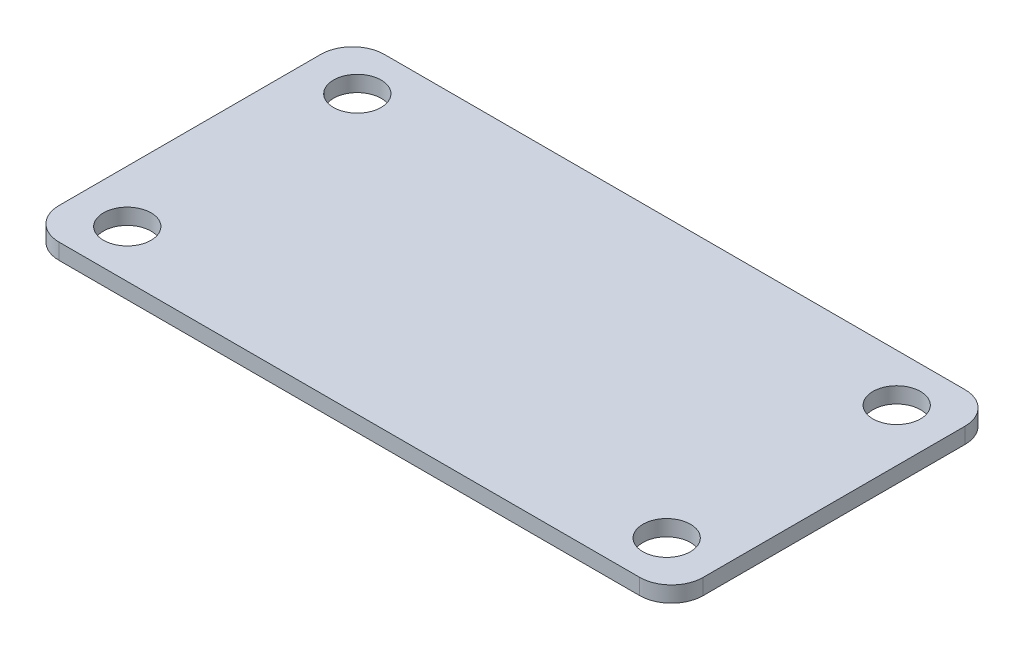
ISO-10303-21;
HEADER;
FILE_DESCRIPTION(('STEP AP214'),'2;1');
FILE_NAME('part.step','',(''),(''),'','','');
FILE_SCHEMA(('AUTOMOTIVE_DESIGN { 1 0 10303 214 1 1 1 1 }'));
ENDSEC;
DATA;
#1=APPLICATION_CONTEXT('core data for automotive mechanical design processes');
#2=APPLICATION_PROTOCOL_DEFINITION('international standard','automotive_design',2000,#1);
#3=PRODUCT_CONTEXT('',#1,'mechanical');
#4=PRODUCT('Part','Part','',(#3));
#5=PRODUCT_RELATED_PRODUCT_CATEGORY('part','',(#4));
#6=PRODUCT_DEFINITION_FORMATION('','',#4);
#7=PRODUCT_DEFINITION_CONTEXT('part definition',#1,'design');
#8=PRODUCT_DEFINITION('design','',#6,#7);
#9=PRODUCT_DEFINITION_SHAPE('','',#8);
#10=(LENGTH_UNIT() NAMED_UNIT(*) SI_UNIT(.MILLI.,.METRE.));
#11=(NAMED_UNIT(*) PLANE_ANGLE_UNIT() SI_UNIT($,.RADIAN.));
#12=(NAMED_UNIT(*) SI_UNIT($,.STERADIAN.) SOLID_ANGLE_UNIT());
#13=UNCERTAINTY_MEASURE_WITH_UNIT(LENGTH_MEASURE(1.E-05),#10,'distance_accuracy_value','');
#14=(GEOMETRIC_REPRESENTATION_CONTEXT(3) GLOBAL_UNCERTAINTY_ASSIGNED_CONTEXT((#13)) GLOBAL_UNIT_ASSIGNED_CONTEXT((#10,
#11,#12)) REPRESENTATION_CONTEXT('',''));
#15=CARTESIAN_POINT('',(0.,0.,0.));
#16=DIRECTION('',(0.,0.,1.));
#17=DIRECTION('',(1.,0.,0.));
#18=AXIS2_PLACEMENT_3D('',#15,#16,#17);
#19=CARTESIAN_POINT('',(0.,1.,0.));
#20=DIRECTION('',(0.,1.,0.));
#21=DIRECTION('',(0.,0.,1.));
#22=AXIS2_PLACEMENT_3D('',#19,#20,#21);
#23=PLANE('',#22);
#24=CARTESIAN_POINT('',(17.,1.,7.25));
#25=DIRECTION('',(0.,1.,0.));
#26=DIRECTION('',(0.,0.,1.));
#27=AXIS2_PLACEMENT_3D('',#24,#25,#26);
#28=CIRCLE('',#27,1.5);
#29=CARTESIAN_POINT('',(17.,1.,8.75));
#30=VERTEX_POINT('',#29);
#31=EDGE_CURVE('E219',#30,#30,#28,.T.);
#32=ORIENTED_EDGE('',*,*,#31,.F.);
#33=EDGE_LOOP('',(#32));
#34=FACE_BOUND('',#33,.T.);
#35=CARTESIAN_POINT('',(-17.,1.,-7.25));
#36=DIRECTION('',(0.,1.,0.));
#37=DIRECTION('',(0.,0.,1.));
#38=AXIS2_PLACEMENT_3D('',#35,#36,#37);
#39=CIRCLE('',#38,1.5);
#40=CARTESIAN_POINT('',(-17.,1.,-5.75));
#41=VERTEX_POINT('',#40);
#42=EDGE_CURVE('E137',#41,#41,#39,.T.);
#43=ORIENTED_EDGE('',*,*,#42,.F.);
#44=EDGE_LOOP('',(#43));
#45=FACE_BOUND('',#44,.T.);
#46=DIRECTION('',(-1.,0.,0.));
#47=VECTOR('',#46,1.);
#48=CARTESIAN_POINT('',(-20.3,1.,-10.25));
#49=LINE('',#48,#47);
#50=CARTESIAN_POINT('',(18.3,1.,-10.25));
#51=VERTEX_POINT('',#50);
#52=CARTESIAN_POINT('',(-18.3,1.,-10.25));
#53=VERTEX_POINT('',#52);
#54=EDGE_CURVE('E148',#51,#53,#49,.T.);
#55=ORIENTED_EDGE('',*,*,#54,.T.);
#56=CARTESIAN_POINT('',(-18.3,1.,-8.25));
#57=DIRECTION('',(0.,1.,0.));
#58=DIRECTION('',(0.,0.,1.));
#59=AXIS2_PLACEMENT_3D('',#56,#57,#58);
#60=CIRCLE('',#59,2.);
#61=CARTESIAN_POINT('',(-20.3,1.,-8.25));
#62=VERTEX_POINT('',#61);
#63=EDGE_CURVE('E178',#53,#62,#60,.T.);
#64=ORIENTED_EDGE('',*,*,#63,.T.);
#65=DIRECTION('',(0.,0.,1.));
#66=VECTOR('',#65,1.);
#67=CARTESIAN_POINT('',(-20.3,1.,-10.25));
#68=LINE('',#67,#66);
#69=CARTESIAN_POINT('',(-20.3,1.,8.25));
#70=VERTEX_POINT('',#69);
#71=EDGE_CURVE('E127',#62,#70,#68,.T.);
#72=ORIENTED_EDGE('',*,*,#71,.T.);
#73=CARTESIAN_POINT('',(-18.3,1.,8.25));
#74=DIRECTION('',(0.,1.,0.));
#75=DIRECTION('',(0.,0.,1.));
#76=AXIS2_PLACEMENT_3D('',#73,#74,#75);
#77=CIRCLE('',#76,2.);
#78=CARTESIAN_POINT('',(-18.3,1.,10.25));
#79=VERTEX_POINT('',#78);
#80=EDGE_CURVE('E170',#70,#79,#77,.T.);
#81=ORIENTED_EDGE('',*,*,#80,.T.);
#82=DIRECTION('',(1.,0.,0.));
#83=VECTOR('',#82,1.);
#84=CARTESIAN_POINT('',(-20.3,1.,10.25));
#85=LINE('',#84,#83);
#86=CARTESIAN_POINT('',(18.3,1.,10.25));
#87=VERTEX_POINT('',#86);
#88=EDGE_CURVE('E193',#79,#87,#85,.T.);
#89=ORIENTED_EDGE('',*,*,#88,.T.);
#90=CARTESIAN_POINT('',(18.3,1.,8.25));
#91=DIRECTION('',(0.,1.,0.));
#92=DIRECTION('',(0.,0.,1.));
#93=AXIS2_PLACEMENT_3D('',#90,#91,#92);
#94=CIRCLE('',#93,2.);
#95=CARTESIAN_POINT('',(20.3,1.,8.25));
#96=VERTEX_POINT('',#95);
#97=EDGE_CURVE('E62',#87,#96,#94,.T.);
#98=ORIENTED_EDGE('',*,*,#97,.T.);
#99=DIRECTION('',(0.,0.,-1.));
#100=VECTOR('',#99,1.);
#101=CARTESIAN_POINT('',(20.3,1.,-10.25));
#102=LINE('',#101,#100);
#103=CARTESIAN_POINT('',(20.3,1.,-8.25));
#104=VERTEX_POINT('',#103);
#105=EDGE_CURVE('E201',#96,#104,#102,.T.);
#106=ORIENTED_EDGE('',*,*,#105,.T.);
#107=CARTESIAN_POINT('',(18.3,1.,-8.25));
#108=DIRECTION('',(0.,1.,0.));
#109=DIRECTION('',(0.,0.,1.));
#110=AXIS2_PLACEMENT_3D('',#107,#108,#109);
#111=CIRCLE('',#110,2.);
#112=EDGE_CURVE('E175',#104,#51,#111,.T.);
#113=ORIENTED_EDGE('',*,*,#112,.T.);
#114=EDGE_LOOP('',(#55,#64,#72,#81,#89,#98,#106,#113));
#115=FACE_BOUND('',#114,.T.);
#116=CARTESIAN_POINT('',(-17.,1.,7.25));
#117=DIRECTION('',(0.,1.,0.));
#118=DIRECTION('',(0.,0.,1.));
#119=AXIS2_PLACEMENT_3D('',#116,#117,#118);
#120=CIRCLE('',#119,1.5);
#121=CARTESIAN_POINT('',(-17.,1.,8.75));
#122=VERTEX_POINT('',#121);
#123=EDGE_CURVE('E213',#122,#122,#120,.T.);
#124=ORIENTED_EDGE('',*,*,#123,.F.);
#125=EDGE_LOOP('',(#124));
#126=FACE_BOUND('',#125,.T.);
#127=CARTESIAN_POINT('',(17.,1.,-7.25));
#128=DIRECTION('',(0.,1.,0.));
#129=DIRECTION('',(0.,0.,1.));
#130=AXIS2_PLACEMENT_3D('',#127,#128,#129);
#131=CIRCLE('',#130,1.5);
#132=CARTESIAN_POINT('',(17.,1.,-5.75));
#133=VERTEX_POINT('',#132);
#134=EDGE_CURVE('E227',#133,#133,#131,.T.);
#135=ORIENTED_EDGE('',*,*,#134,.F.);
#136=EDGE_LOOP('',(#135));
#137=FACE_BOUND('',#136,.T.);
#138=ADVANCED_FACE('F39',(#34,#45,#115,#126,#137),#23,.T.);
#139=CARTESIAN_POINT('',(0.,0.,0.));
#140=DIRECTION('',(0.,1.,0.));
#141=DIRECTION('',(0.,0.,1.));
#142=AXIS2_PLACEMENT_3D('',#139,#140,#141);
#143=PLANE('',#142);
#144=DIRECTION('',(0.,0.,1.));
#145=VECTOR('',#144,1.);
#146=CARTESIAN_POINT('',(-20.3,0.,-10.25));
#147=LINE('',#146,#145);
#148=CARTESIAN_POINT('',(-20.3,0.,-8.25));
#149=VERTEX_POINT('',#148);
#150=CARTESIAN_POINT('',(-20.3,0.,8.25));
#151=VERTEX_POINT('',#150);
#152=EDGE_CURVE('E124',#149,#151,#147,.T.);
#153=ORIENTED_EDGE('',*,*,#152,.F.);
#154=CARTESIAN_POINT('',(-18.3,0.,-8.25));
#155=DIRECTION('',(0.,1.,0.));
#156=DIRECTION('',(0.,0.,1.));
#157=AXIS2_PLACEMENT_3D('',#154,#155,#156);
#158=CIRCLE('',#157,2.);
#159=CARTESIAN_POINT('',(-18.3,0.,-10.25));
#160=VERTEX_POINT('',#159);
#161=EDGE_CURVE('E106',#149,#160,#158,.F.);
#162=ORIENTED_EDGE('',*,*,#161,.T.);
#163=DIRECTION('',(-1.,0.,0.));
#164=VECTOR('',#163,1.);
#165=CARTESIAN_POINT('',(-20.3,0.,-10.25));
#166=LINE('',#165,#164);
#167=CARTESIAN_POINT('',(18.3,0.,-10.25));
#168=VERTEX_POINT('',#167);
#169=EDGE_CURVE('E153',#168,#160,#166,.T.);
#170=ORIENTED_EDGE('',*,*,#169,.F.);
#171=CARTESIAN_POINT('',(18.3,0.,-8.25));
#172=DIRECTION('',(0.,1.,0.));
#173=DIRECTION('',(0.,0.,1.));
#174=AXIS2_PLACEMENT_3D('',#171,#172,#173);
#175=CIRCLE('',#174,2.);
#176=CARTESIAN_POINT('',(20.3,0.,-8.25));
#177=VERTEX_POINT('',#176);
#178=EDGE_CURVE('E118',#168,#177,#175,.F.);
#179=ORIENTED_EDGE('',*,*,#178,.T.);
#180=DIRECTION('',(0.,0.,-1.));
#181=VECTOR('',#180,1.);
#182=CARTESIAN_POINT('',(20.3,0.,-10.25));
#183=LINE('',#182,#181);
#184=CARTESIAN_POINT('',(20.3,0.,8.25));
#185=VERTEX_POINT('',#184);
#186=EDGE_CURVE('E142',#185,#177,#183,.T.);
#187=ORIENTED_EDGE('',*,*,#186,.F.);
#188=CARTESIAN_POINT('',(18.3,0.,8.25));
#189=DIRECTION('',(0.,1.,0.));
#190=DIRECTION('',(0.,0.,1.));
#191=AXIS2_PLACEMENT_3D('',#188,#189,#190);
#192=CIRCLE('',#191,2.);
#193=CARTESIAN_POINT('',(18.3,0.,10.25));
#194=VERTEX_POINT('',#193);
#195=EDGE_CURVE('E160',#185,#194,#192,.F.);
#196=ORIENTED_EDGE('',*,*,#195,.T.);
#197=DIRECTION('',(1.,0.,0.));
#198=VECTOR('',#197,1.);
#199=CARTESIAN_POINT('',(-20.3,0.,10.25));
#200=LINE('',#199,#198);
#201=CARTESIAN_POINT('',(-18.3,0.,10.25));
#202=VERTEX_POINT('',#201);
#203=EDGE_CURVE('E136',#202,#194,#200,.T.);
#204=ORIENTED_EDGE('',*,*,#203,.F.);
#205=CARTESIAN_POINT('',(-18.3,0.,8.25));
#206=DIRECTION('',(0.,1.,0.));
#207=DIRECTION('',(0.,0.,1.));
#208=AXIS2_PLACEMENT_3D('',#205,#206,#207);
#209=CIRCLE('',#208,2.);
#210=EDGE_CURVE('E129',#202,#151,#209,.F.);
#211=ORIENTED_EDGE('',*,*,#210,.T.);
#212=EDGE_LOOP('',(#153,#162,#170,#179,#187,#196,#204,#211));
#213=FACE_BOUND('',#212,.T.);
#214=CARTESIAN_POINT('',(-17.,0.,-7.25));
#215=DIRECTION('',(0.,1.,0.));
#216=DIRECTION('',(0.,0.,1.));
#217=AXIS2_PLACEMENT_3D('',#214,#215,#216);
#218=CIRCLE('',#217,1.5);
#219=CARTESIAN_POINT('',(-17.,0.,-5.75));
#220=VERTEX_POINT('',#219);
#221=EDGE_CURVE('E145',#220,#220,#218,.T.);
#222=ORIENTED_EDGE('',*,*,#221,.T.);
#223=EDGE_LOOP('',(#222));
#224=FACE_BOUND('',#223,.T.);
#225=CARTESIAN_POINT('',(-17.,0.,7.25));
#226=DIRECTION('',(0.,1.,0.));
#227=DIRECTION('',(0.,0.,1.));
#228=AXIS2_PLACEMENT_3D('',#225,#226,#227);
#229=CIRCLE('',#228,1.5);
#230=CARTESIAN_POINT('',(-17.,0.,8.75));
#231=VERTEX_POINT('',#230);
#232=EDGE_CURVE('E215',#231,#231,#229,.T.);
#233=ORIENTED_EDGE('',*,*,#232,.T.);
#234=EDGE_LOOP('',(#233));
#235=FACE_BOUND('',#234,.T.);
#236=CARTESIAN_POINT('',(17.,0.,7.25));
#237=DIRECTION('',(0.,1.,0.));
#238=DIRECTION('',(0.,0.,1.));
#239=AXIS2_PLACEMENT_3D('',#236,#237,#238);
#240=CIRCLE('',#239,1.5);
#241=CARTESIAN_POINT('',(17.,0.,8.75));
#242=VERTEX_POINT('',#241);
#243=EDGE_CURVE('E223',#242,#242,#240,.T.);
#244=ORIENTED_EDGE('',*,*,#243,.T.);
#245=EDGE_LOOP('',(#244));
#246=FACE_BOUND('',#245,.T.);
#247=CARTESIAN_POINT('',(17.,0.,-7.25));
#248=DIRECTION('',(0.,1.,0.));
#249=DIRECTION('',(0.,0.,1.));
#250=AXIS2_PLACEMENT_3D('',#247,#248,#249);
#251=CIRCLE('',#250,1.5);
#252=CARTESIAN_POINT('',(17.,0.,-5.75));
#253=VERTEX_POINT('',#252);
#254=EDGE_CURVE('E231',#253,#253,#251,.T.);
#255=ORIENTED_EDGE('',*,*,#254,.T.);
#256=EDGE_LOOP('',(#255));
#257=FACE_BOUND('',#256,.T.);
#258=ADVANCED_FACE('F132',(#213,#224,#235,#246,#257),#143,.F.);
#259=CARTESIAN_POINT('',(-20.3,1.,-10.25));
#260=DIRECTION('',(1.,0.,0.));
#261=DIRECTION('',(0.,0.,-1.));
#262=AXIS2_PLACEMENT_3D('',#259,#260,#261);
#263=PLANE('',#262);
#264=ORIENTED_EDGE('',*,*,#71,.F.);
#265=DIRECTION('',(0.,-1.,0.));
#266=VECTOR('',#265,1.);
#267=CARTESIAN_POINT('',(-20.3,1.,-8.25));
#268=LINE('',#267,#266);
#269=EDGE_CURVE('E110',#62,#149,#268,.T.);
#270=ORIENTED_EDGE('',*,*,#269,.T.);
#271=ORIENTED_EDGE('',*,*,#152,.T.);
#272=DIRECTION('',(0.,-1.,0.));
#273=VECTOR('',#272,1.);
#274=CARTESIAN_POINT('',(-20.3,1.,8.25));
#275=LINE('',#274,#273);
#276=EDGE_CURVE('E130',#151,#70,#275,.F.);
#277=ORIENTED_EDGE('',*,*,#276,.T.);
#278=EDGE_LOOP('',(#264,#270,#271,#277));
#279=FACE_BOUND('',#278,.T.);
#280=ADVANCED_FACE('F123',(#279),#263,.F.);
#281=CARTESIAN_POINT('',(-20.3,1.,10.25));
#282=DIRECTION('',(0.,0.,-1.));
#283=DIRECTION('',(-1.,0.,0.));
#284=AXIS2_PLACEMENT_3D('',#281,#282,#283);
#285=PLANE('',#284);
#286=ORIENTED_EDGE('',*,*,#203,.T.);
#287=DIRECTION('',(0.,-1.,0.));
#288=VECTOR('',#287,1.);
#289=CARTESIAN_POINT('',(18.3,1.,10.25));
#290=LINE('',#289,#288);
#291=EDGE_CURVE('E11',#194,#87,#290,.F.);
#292=ORIENTED_EDGE('',*,*,#291,.T.);
#293=ORIENTED_EDGE('',*,*,#88,.F.);
#294=DIRECTION('',(0.,-1.,0.));
#295=VECTOR('',#294,1.);
#296=CARTESIAN_POINT('',(-18.3,1.,10.25));
#297=LINE('',#296,#295);
#298=EDGE_CURVE('E48',#79,#202,#297,.T.);
#299=ORIENTED_EDGE('',*,*,#298,.T.);
#300=EDGE_LOOP('',(#286,#292,#293,#299));
#301=FACE_BOUND('',#300,.T.);
#302=ADVANCED_FACE('F191',(#301),#285,.F.);
#303=CARTESIAN_POINT('',(20.3,1.,-10.25));
#304=DIRECTION('',(-1.,0.,0.));
#305=DIRECTION('',(0.,0.,1.));
#306=AXIS2_PLACEMENT_3D('',#303,#304,#305);
#307=PLANE('',#306);
#308=ORIENTED_EDGE('',*,*,#186,.T.);
#309=DIRECTION('',(0.,-1.,0.));
#310=VECTOR('',#309,1.);
#311=CARTESIAN_POINT('',(20.3,1.,-8.25));
#312=LINE('',#311,#310);
#313=EDGE_CURVE('E55',#177,#104,#312,.F.);
#314=ORIENTED_EDGE('',*,*,#313,.T.);
#315=ORIENTED_EDGE('',*,*,#105,.F.);
#316=DIRECTION('',(0.,-1.,0.));
#317=VECTOR('',#316,1.);
#318=CARTESIAN_POINT('',(20.3,1.,8.25));
#319=LINE('',#318,#317);
#320=EDGE_CURVE('E181',#96,#185,#319,.T.);
#321=ORIENTED_EDGE('',*,*,#320,.T.);
#322=EDGE_LOOP('',(#308,#314,#315,#321));
#323=FACE_BOUND('',#322,.T.);
#324=ADVANCED_FACE('F200',(#323),#307,.F.);
#325=CARTESIAN_POINT('',(-20.3,1.,-10.25));
#326=DIRECTION('',(0.,0.,1.));
#327=DIRECTION('',(1.,0.,0.));
#328=AXIS2_PLACEMENT_3D('',#325,#326,#327);
#329=PLANE('',#328);
#330=ORIENTED_EDGE('',*,*,#169,.T.);
#331=DIRECTION('',(0.,-1.,0.));
#332=VECTOR('',#331,1.);
#333=CARTESIAN_POINT('',(-18.3,1.,-10.25));
#334=LINE('',#333,#332);
#335=EDGE_CURVE('E111',#160,#53,#334,.F.);
#336=ORIENTED_EDGE('',*,*,#335,.T.);
#337=ORIENTED_EDGE('',*,*,#54,.F.);
#338=DIRECTION('',(0.,-1.,0.));
#339=VECTOR('',#338,1.);
#340=CARTESIAN_POINT('',(18.3,1.,-10.25));
#341=LINE('',#340,#339);
#342=EDGE_CURVE('E117',#51,#168,#341,.T.);
#343=ORIENTED_EDGE('',*,*,#342,.T.);
#344=EDGE_LOOP('',(#330,#336,#337,#343));
#345=FACE_BOUND('',#344,.T.);
#346=ADVANCED_FACE('F255',(#345),#329,.F.);
#347=CARTESIAN_POINT('',(-17.,1.,-7.25));
#348=DIRECTION('',(0.,-1.,0.));
#349=DIRECTION('',(0.,0.,-1.));
#350=AXIS2_PLACEMENT_3D('',#347,#348,#349);
#351=CYLINDRICAL_SURFACE('',#350,1.5);
#352=ORIENTED_EDGE('',*,*,#42,.T.);
#353=EDGE_LOOP('',(#352));
#354=FACE_BOUND('',#353,.T.);
#355=ORIENTED_EDGE('',*,*,#221,.F.);
#356=EDGE_LOOP('',(#355));
#357=FACE_BOUND('',#356,.T.);
#358=ADVANCED_FACE('F252',(#354,#357),#351,.F.);
#359=CARTESIAN_POINT('',(-17.,1.,7.25));
#360=DIRECTION('',(0.,-1.,0.));
#361=DIRECTION('',(0.,0.,-1.));
#362=AXIS2_PLACEMENT_3D('',#359,#360,#361);
#363=CYLINDRICAL_SURFACE('',#362,1.5);
#364=ORIENTED_EDGE('',*,*,#123,.T.);
#365=EDGE_LOOP('',(#364));
#366=FACE_BOUND('',#365,.T.);
#367=ORIENTED_EDGE('',*,*,#232,.F.);
#368=EDGE_LOOP('',(#367));
#369=FACE_BOUND('',#368,.T.);
#370=ADVANCED_FACE('F281',(#366,#369),#363,.F.);
#371=CARTESIAN_POINT('',(17.,1.,7.25));
#372=DIRECTION('',(0.,-1.,0.));
#373=DIRECTION('',(0.,0.,-1.));
#374=AXIS2_PLACEMENT_3D('',#371,#372,#373);
#375=CYLINDRICAL_SURFACE('',#374,1.5);
#376=ORIENTED_EDGE('',*,*,#31,.T.);
#377=EDGE_LOOP('',(#376));
#378=FACE_BOUND('',#377,.T.);
#379=ORIENTED_EDGE('',*,*,#243,.F.);
#380=EDGE_LOOP('',(#379));
#381=FACE_BOUND('',#380,.T.);
#382=ADVANCED_FACE('F284',(#378,#381),#375,.F.);
#383=CARTESIAN_POINT('',(17.,1.,-7.25));
#384=DIRECTION('',(0.,-1.,0.));
#385=DIRECTION('',(0.,0.,-1.));
#386=AXIS2_PLACEMENT_3D('',#383,#384,#385);
#387=CYLINDRICAL_SURFACE('',#386,1.5);
#388=ORIENTED_EDGE('',*,*,#134,.T.);
#389=EDGE_LOOP('',(#388));
#390=FACE_BOUND('',#389,.T.);
#391=ORIENTED_EDGE('',*,*,#254,.F.);
#392=EDGE_LOOP('',(#391));
#393=FACE_BOUND('',#392,.T.);
#394=ADVANCED_FACE('F239',(#390,#393),#387,.F.);
#395=CARTESIAN_POINT('',(-18.3,1.,-8.25));
#396=DIRECTION('',(0.,-1.,0.));
#397=DIRECTION('',(0.,0.,-1.));
#398=AXIS2_PLACEMENT_3D('',#395,#396,#397);
#399=CYLINDRICAL_SURFACE('',#398,2.);
#400=ORIENTED_EDGE('',*,*,#63,.F.);
#401=ORIENTED_EDGE('',*,*,#335,.F.);
#402=ORIENTED_EDGE('',*,*,#161,.F.);
#403=ORIENTED_EDGE('',*,*,#269,.F.);
#404=EDGE_LOOP('',(#400,#401,#402,#403));
#405=FACE_BOUND('',#404,.T.);
#406=ADVANCED_FACE('F109',(#405),#399,.T.);
#407=CARTESIAN_POINT('',(18.3,1.,-8.25));
#408=DIRECTION('',(0.,-1.,0.));
#409=DIRECTION('',(0.,0.,-1.));
#410=AXIS2_PLACEMENT_3D('',#407,#408,#409);
#411=CYLINDRICAL_SURFACE('',#410,2.);
#412=ORIENTED_EDGE('',*,*,#112,.F.);
#413=ORIENTED_EDGE('',*,*,#313,.F.);
#414=ORIENTED_EDGE('',*,*,#178,.F.);
#415=ORIENTED_EDGE('',*,*,#342,.F.);
#416=EDGE_LOOP('',(#412,#413,#414,#415));
#417=FACE_BOUND('',#416,.T.);
#418=ADVANCED_FACE('F267',(#417),#411,.T.);
#419=CARTESIAN_POINT('',(18.3,1.,8.25));
#420=DIRECTION('',(0.,-1.,0.));
#421=DIRECTION('',(0.,0.,-1.));
#422=AXIS2_PLACEMENT_3D('',#419,#420,#421);
#423=CYLINDRICAL_SURFACE('',#422,2.);
#424=ORIENTED_EDGE('',*,*,#97,.F.);
#425=ORIENTED_EDGE('',*,*,#291,.F.);
#426=ORIENTED_EDGE('',*,*,#195,.F.);
#427=ORIENTED_EDGE('',*,*,#320,.F.);
#428=EDGE_LOOP('',(#424,#425,#426,#427));
#429=FACE_BOUND('',#428,.T.);
#430=ADVANCED_FACE('F199',(#429),#423,.T.);
#431=CARTESIAN_POINT('',(-18.3,1.,8.25));
#432=DIRECTION('',(0.,-1.,0.));
#433=DIRECTION('',(0.,0.,-1.));
#434=AXIS2_PLACEMENT_3D('',#431,#432,#433);
#435=CYLINDRICAL_SURFACE('',#434,2.);
#436=ORIENTED_EDGE('',*,*,#80,.F.);
#437=ORIENTED_EDGE('',*,*,#276,.F.);
#438=ORIENTED_EDGE('',*,*,#210,.F.);
#439=ORIENTED_EDGE('',*,*,#298,.F.);
#440=EDGE_LOOP('',(#436,#437,#438,#439));
#441=FACE_BOUND('',#440,.T.);
#442=ADVANCED_FACE('F41',(#441),#435,.T.);
#443=CLOSED_SHELL('',(#138,#258,#280,#302,#324,#346,#358,#370,#382,#394,#406,#418,#430,#442));
#444=MANIFOLD_SOLID_BREP('B2',#443);
#445=ADVANCED_BREP_SHAPE_REPRESENTATION('',(#18,#444),#14);
#446=SHAPE_DEFINITION_REPRESENTATION(#9,#445);
ENDSEC;
END-ISO-10303-21;
